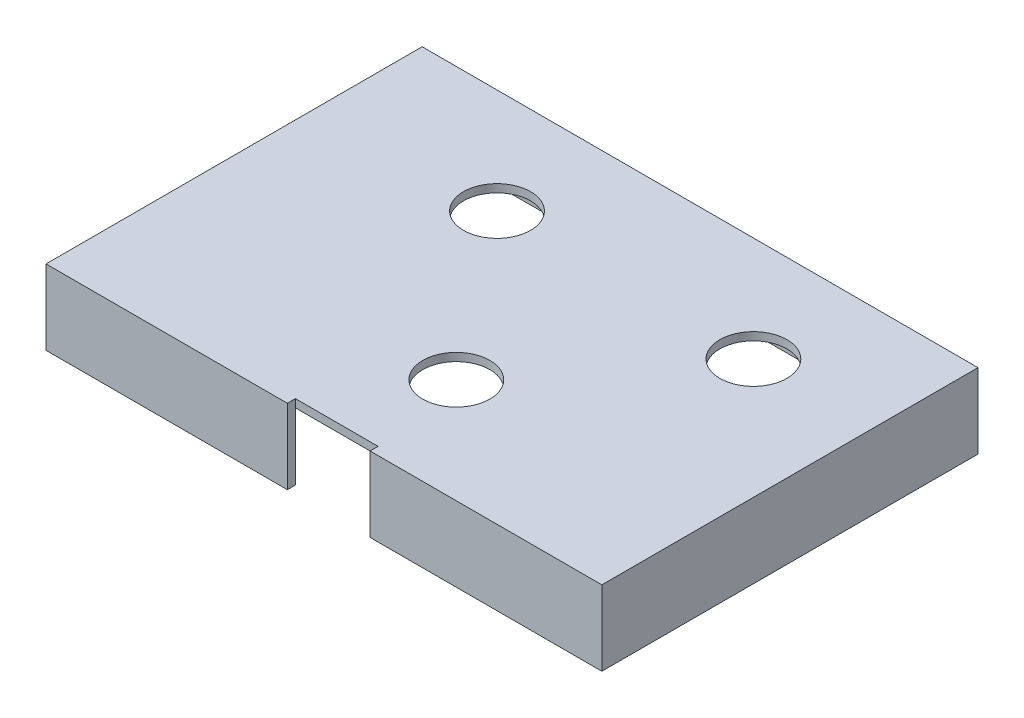
ISO-10303-21;
HEADER;
FILE_DESCRIPTION(('STEP AP214'),'2;1');
FILE_NAME('part.step','',(''),(''),'','','');
FILE_SCHEMA(('AUTOMOTIVE_DESIGN { 1 0 10303 214 1 1 1 1 }'));
ENDSEC;
DATA;
#1=APPLICATION_CONTEXT('core data for automotive mechanical design processes');
#2=APPLICATION_PROTOCOL_DEFINITION('international standard','automotive_design',2000,#1);
#3=PRODUCT_CONTEXT('',#1,'mechanical');
#4=PRODUCT('Part','Part','',(#3));
#5=PRODUCT_RELATED_PRODUCT_CATEGORY('part','',(#4));
#6=PRODUCT_DEFINITION_FORMATION('','',#4);
#7=PRODUCT_DEFINITION_CONTEXT('part definition',#1,'design');
#8=PRODUCT_DEFINITION('design','',#6,#7);
#9=PRODUCT_DEFINITION_SHAPE('','',#8);
#10=(LENGTH_UNIT() NAMED_UNIT(*) SI_UNIT(.MILLI.,.METRE.));
#11=(NAMED_UNIT(*) PLANE_ANGLE_UNIT() SI_UNIT($,.RADIAN.));
#12=(NAMED_UNIT(*) SI_UNIT($,.STERADIAN.) SOLID_ANGLE_UNIT());
#13=UNCERTAINTY_MEASURE_WITH_UNIT(LENGTH_MEASURE(1.E-05),#10,'distance_accuracy_value','');
#14=(GEOMETRIC_REPRESENTATION_CONTEXT(3) GLOBAL_UNCERTAINTY_ASSIGNED_CONTEXT((#13)) GLOBAL_UNIT_ASSIGNED_CONTEXT((#10,
#11,#12)) REPRESENTATION_CONTEXT('',''));
#15=CARTESIAN_POINT('',(0.,0.,0.));
#16=DIRECTION('',(0.,0.,1.));
#17=DIRECTION('',(1.,0.,0.));
#18=AXIS2_PLACEMENT_3D('',#15,#16,#17);
#19=CARTESIAN_POINT('',(0.,31.75,0.));
#20=DIRECTION('',(0.,0.,-1.));
#21=DIRECTION('',(-1.,0.,0.));
#22=AXIS2_PLACEMENT_3D('',#19,#20,#21);
#23=PLANE('',#22);
#24=DIRECTION('',(1.,0.,0.));
#25=VECTOR('',#24,1.);
#26=CARTESIAN_POINT('',(0.,0.,0.));
#27=LINE('',#26,#25);
#28=CARTESIAN_POINT('',(0.,0.,0.));
#29=VERTEX_POINT('',#28);
#30=CARTESIAN_POINT('',(102.362,0.,0.));
#31=VERTEX_POINT('',#30);
#32=EDGE_CURVE('E176',#29,#31,#27,.T.);
#33=ORIENTED_EDGE('',*,*,#32,.T.);
#34=DIRECTION('',(0.,1.,0.));
#35=VECTOR('',#34,1.);
#36=CARTESIAN_POINT('',(102.362,0.,0.));
#37=LINE('',#36,#35);
#38=CARTESIAN_POINT('',(102.362,31.75,0.));
#39=VERTEX_POINT('',#38);
#40=EDGE_CURVE('E229',#31,#39,#37,.T.);
#41=ORIENTED_EDGE('',*,*,#40,.T.);
#42=DIRECTION('',(1.,0.,0.));
#43=VECTOR('',#42,1.);
#44=CARTESIAN_POINT('',(0.,31.75,0.));
#45=LINE('',#44,#43);
#46=CARTESIAN_POINT('',(0.,31.75,0.));
#47=VERTEX_POINT('',#46);
#48=EDGE_CURVE('E284',#47,#39,#45,.T.);
#49=ORIENTED_EDGE('',*,*,#48,.F.);
#50=DIRECTION('',(0.,-1.,0.));
#51=VECTOR('',#50,1.);
#52=CARTESIAN_POINT('',(0.,31.75,0.));
#53=LINE('',#52,#51);
#54=EDGE_CURVE('E11',#47,#29,#53,.T.);
#55=ORIENTED_EDGE('',*,*,#54,.T.);
#56=EDGE_LOOP('',(#33,#41,#49,#55));
#57=FACE_BOUND('',#56,.T.);
#58=ADVANCED_FACE('F45',(#57),#23,.F.);
#59=CARTESIAN_POINT('',(3.40359999999994,28.3464,-3.4036));
#60=DIRECTION('',(0.,0.,1.));
#61=DIRECTION('',(1.,0.,0.));
#62=AXIS2_PLACEMENT_3D('',#59,#60,#61);
#63=PLANE('',#62);
#64=DIRECTION('',(-1.,0.,0.));
#65=VECTOR('',#64,1.);
#66=CARTESIAN_POINT('',(3.40359999999994,28.3464,-3.4036));
#67=LINE('',#66,#65);
#68=CARTESIAN_POINT('',(102.362,28.3464,-3.4036));
#69=VERTEX_POINT('',#68);
#70=CARTESIAN_POINT('',(3.40359999999994,28.3464,-3.4036));
#71=VERTEX_POINT('',#70);
#72=EDGE_CURVE('E251',#69,#71,#67,.T.);
#73=ORIENTED_EDGE('',*,*,#72,.F.);
#74=DIRECTION('',(0.,1.,0.));
#75=VECTOR('',#74,1.);
#76=CARTESIAN_POINT('',(102.362,0.,-3.4036));
#77=LINE('',#76,#75);
#78=CARTESIAN_POINT('',(102.362,0.,-3.4036));
#79=VERTEX_POINT('',#78);
#80=EDGE_CURVE('E63',#79,#69,#77,.T.);
#81=ORIENTED_EDGE('',*,*,#80,.F.);
#82=DIRECTION('',(-1.,0.,0.));
#83=VECTOR('',#82,1.);
#84=CARTESIAN_POINT('',(3.40359999999994,0.,-3.4036));
#85=LINE('',#84,#83);
#86=CARTESIAN_POINT('',(3.40359999999994,0.,-3.4036));
#87=VERTEX_POINT('',#86);
#88=EDGE_CURVE('E268',#79,#87,#85,.T.);
#89=ORIENTED_EDGE('',*,*,#88,.T.);
#90=DIRECTION('',(0.,-1.,0.));
#91=VECTOR('',#90,1.);
#92=CARTESIAN_POINT('',(3.40359999999994,28.3464,-3.4036));
#93=LINE('',#92,#91);
#94=EDGE_CURVE('E183',#71,#87,#93,.T.);
#95=ORIENTED_EDGE('',*,*,#94,.F.);
#96=EDGE_LOOP('',(#73,#81,#89,#95));
#97=FACE_BOUND('',#96,.T.);
#98=ADVANCED_FACE('F315',(#97),#63,.F.);
#99=CARTESIAN_POINT('',(0.,31.75,0.));
#100=DIRECTION('',(1.,0.,0.));
#101=DIRECTION('',(0.,0.,-1.));
#102=AXIS2_PLACEMENT_3D('',#99,#100,#101);
#103=PLANE('',#102);
#104=DIRECTION('',(0.,0.,1.));
#105=VECTOR('',#104,1.);
#106=CARTESIAN_POINT('',(0.,0.,0.));
#107=LINE('',#106,#105);
#108=CARTESIAN_POINT('',(0.,0.,-159.512));
#109=VERTEX_POINT('',#108);
#110=EDGE_CURVE('E177',#109,#29,#107,.T.);
#111=ORIENTED_EDGE('',*,*,#110,.T.);
#112=ORIENTED_EDGE('',*,*,#54,.F.);
#113=DIRECTION('',(0.,0.,1.));
#114=VECTOR('',#113,1.);
#115=CARTESIAN_POINT('',(0.,31.75,0.));
#116=LINE('',#115,#114);
#117=CARTESIAN_POINT('',(0.,31.75,-159.512));
#118=VERTEX_POINT('',#117);
#119=EDGE_CURVE('E192',#118,#47,#116,.T.);
#120=ORIENTED_EDGE('',*,*,#119,.F.);
#121=DIRECTION('',(0.,-1.,0.));
#122=VECTOR('',#121,1.);
#123=CARTESIAN_POINT('',(0.,31.75,-159.512));
#124=LINE('',#123,#122);
#125=EDGE_CURVE('E193',#118,#109,#124,.T.);
#126=ORIENTED_EDGE('',*,*,#125,.T.);
#127=EDGE_LOOP('',(#111,#112,#120,#126));
#128=FACE_BOUND('',#127,.T.);
#129=ADVANCED_FACE('F47',(#128),#103,.F.);
#130=CARTESIAN_POINT('',(137.414,31.75,0.));
#131=VERTEX_POINT('',#130);
#132=CARTESIAN_POINT('',(235.712,31.75,0.));
#133=VERTEX_POINT('',#132);
#134=EDGE_CURVE('E166',#131,#133,#45,.T.);
#135=ORIENTED_EDGE('',*,*,#134,.F.);
#136=DIRECTION('',(0.,1.,0.));
#137=VECTOR('',#136,1.);
#138=CARTESIAN_POINT('',(137.414,0.,0.));
#139=LINE('',#138,#137);
#140=CARTESIAN_POINT('',(137.414,0.,0.));
#141=VERTEX_POINT('',#140);
#142=EDGE_CURVE('E147',#141,#131,#139,.T.);
#143=ORIENTED_EDGE('',*,*,#142,.F.);
#144=CARTESIAN_POINT('',(235.712,0.,0.));
#145=VERTEX_POINT('',#144);
#146=EDGE_CURVE('E164',#141,#145,#27,.T.);
#147=ORIENTED_EDGE('',*,*,#146,.T.);
#148=DIRECTION('',(0.,-1.,0.));
#149=VECTOR('',#148,1.);
#150=CARTESIAN_POINT('',(235.712,31.75,0.));
#151=LINE('',#150,#149);
#152=EDGE_CURVE('E55',#133,#145,#151,.T.);
#153=ORIENTED_EDGE('',*,*,#152,.F.);
#154=EDGE_LOOP('',(#135,#143,#147,#153));
#155=FACE_BOUND('',#154,.T.);
#156=ADVANCED_FACE('F162',(#155),#23,.F.);
#157=CARTESIAN_POINT('',(235.712,31.75,0.));
#158=DIRECTION('',(-1.,0.,0.));
#159=DIRECTION('',(0.,0.,1.));
#160=AXIS2_PLACEMENT_3D('',#157,#158,#159);
#161=PLANE('',#160);
#162=DIRECTION('',(0.,0.,-1.));
#163=VECTOR('',#162,1.);
#164=CARTESIAN_POINT('',(235.712,0.,0.));
#165=LINE('',#164,#163);
#166=CARTESIAN_POINT('',(235.712,0.,-159.512));
#167=VERTEX_POINT('',#166);
#168=EDGE_CURVE('E174',#145,#167,#165,.T.);
#169=ORIENTED_EDGE('',*,*,#168,.T.);
#170=DIRECTION('',(0.,-1.,0.));
#171=VECTOR('',#170,1.);
#172=CARTESIAN_POINT('',(235.712,31.75,-159.512));
#173=LINE('',#172,#171);
#174=CARTESIAN_POINT('',(235.712,31.75,-159.512));
#175=VERTEX_POINT('',#174);
#176=EDGE_CURVE('E197',#175,#167,#173,.T.);
#177=ORIENTED_EDGE('',*,*,#176,.F.);
#178=DIRECTION('',(0.,0.,-1.));
#179=VECTOR('',#178,1.);
#180=CARTESIAN_POINT('',(235.712,31.75,0.));
#181=LINE('',#180,#179);
#182=EDGE_CURVE('E288',#133,#175,#181,.T.);
#183=ORIENTED_EDGE('',*,*,#182,.F.);
#184=ORIENTED_EDGE('',*,*,#152,.T.);
#185=EDGE_LOOP('',(#169,#177,#183,#184));
#186=FACE_BOUND('',#185,.T.);
#187=ADVANCED_FACE('F354',(#186),#161,.F.);
#188=CARTESIAN_POINT('',(0.,31.75,-159.512));
#189=DIRECTION('',(0.,0.,1.));
#190=DIRECTION('',(1.,0.,0.));
#191=AXIS2_PLACEMENT_3D('',#188,#189,#190);
#192=PLANE('',#191);
#193=DIRECTION('',(-1.,0.,0.));
#194=VECTOR('',#193,1.);
#195=CARTESIAN_POINT('',(0.,0.,-159.512));
#196=LINE('',#195,#194);
#197=EDGE_CURVE('E189',#167,#109,#196,.T.);
#198=ORIENTED_EDGE('',*,*,#197,.T.);
#199=ORIENTED_EDGE('',*,*,#125,.F.);
#200=DIRECTION('',(-1.,0.,0.));
#201=VECTOR('',#200,1.);
#202=CARTESIAN_POINT('',(0.,31.75,-159.512));
#203=LINE('',#202,#201);
#204=EDGE_CURVE('E198',#175,#118,#203,.T.);
#205=ORIENTED_EDGE('',*,*,#204,.F.);
#206=ORIENTED_EDGE('',*,*,#176,.T.);
#207=EDGE_LOOP('',(#198,#199,#205,#206));
#208=FACE_BOUND('',#207,.T.);
#209=ADVANCED_FACE('F300',(#208),#192,.F.);
#210=CARTESIAN_POINT('',(0.,31.75,0.));
#211=DIRECTION('',(0.,-1.,0.));
#212=DIRECTION('',(0.,0.,-1.));
#213=AXIS2_PLACEMENT_3D('',#210,#211,#212);
#214=PLANE('',#213);
#215=CARTESIAN_POINT('',(76.1999999999999,31.75,-115.062));
#216=DIRECTION('',(0.,1.,0.));
#217=DIRECTION('',(0.,0.,1.));
#218=AXIS2_PLACEMENT_3D('',#215,#216,#217);
#219=CIRCLE('',#218,14.224);
#220=CARTESIAN_POINT('',(76.1999999999999,31.75,-100.838));
#221=VERTEX_POINT('',#220);
#222=EDGE_CURVE('E208',#221,#221,#219,.T.);
#223=ORIENTED_EDGE('',*,*,#222,.F.);
#224=EDGE_LOOP('',(#223));
#225=FACE_BOUND('',#224,.T.);
#226=CARTESIAN_POINT('',(129.54,31.75,-44.45));
#227=DIRECTION('',(0.,1.,0.));
#228=DIRECTION('',(0.,0.,1.));
#229=AXIS2_PLACEMENT_3D('',#226,#227,#228);
#230=CIRCLE('',#229,14.224);
#231=CARTESIAN_POINT('',(129.54,31.75,-30.226));
#232=VERTEX_POINT('',#231);
#233=EDGE_CURVE('E488',#232,#232,#230,.T.);
#234=ORIENTED_EDGE('',*,*,#233,.F.);
#235=EDGE_LOOP('',(#234));
#236=FACE_BOUND('',#235,.T.);
#237=CARTESIAN_POINT('',(184.912,31.75,-115.062));
#238=DIRECTION('',(0.,1.,0.));
#239=DIRECTION('',(0.,0.,1.));
#240=AXIS2_PLACEMENT_3D('',#237,#238,#239);
#241=CIRCLE('',#240,14.224);
#242=CARTESIAN_POINT('',(184.912,31.75,-100.838));
#243=VERTEX_POINT('',#242);
#244=EDGE_CURVE('E492',#243,#243,#241,.T.);
#245=ORIENTED_EDGE('',*,*,#244,.F.);
#246=EDGE_LOOP('',(#245));
#247=FACE_BOUND('',#246,.T.);
#248=ORIENTED_EDGE('',*,*,#48,.T.);
#249=DIRECTION('',(0.,0.,1.));
#250=VECTOR('',#249,1.);
#251=CARTESIAN_POINT('',(102.362,31.75,0.));
#252=LINE('',#251,#250);
#253=CARTESIAN_POINT('',(102.362,31.75,-3.4036));
#254=VERTEX_POINT('',#253);
#255=EDGE_CURVE('E158',#254,#39,#252,.T.);
#256=ORIENTED_EDGE('',*,*,#255,.F.);
#257=DIRECTION('',(-1.,0.,0.));
#258=VECTOR('',#257,1.);
#259=CARTESIAN_POINT('',(102.362,31.75,-3.4036));
#260=LINE('',#259,#258);
#261=CARTESIAN_POINT('',(137.414,31.75,-3.4036));
#262=VERTEX_POINT('',#261);
#263=EDGE_CURVE('E219',#262,#254,#260,.T.);
#264=ORIENTED_EDGE('',*,*,#263,.F.);
#265=DIRECTION('',(0.,0.,-1.));
#266=VECTOR('',#265,1.);
#267=CARTESIAN_POINT('',(137.414,31.75,-3.4036));
#268=LINE('',#267,#266);
#269=EDGE_CURVE('E215',#131,#262,#268,.T.);
#270=ORIENTED_EDGE('',*,*,#269,.F.);
#271=ORIENTED_EDGE('',*,*,#134,.T.);
#272=ORIENTED_EDGE('',*,*,#182,.T.);
#273=ORIENTED_EDGE('',*,*,#204,.T.);
#274=ORIENTED_EDGE('',*,*,#119,.T.);
#275=EDGE_LOOP('',(#248,#256,#264,#270,#271,#272,#273,#274));
#276=FACE_BOUND('',#275,.T.);
#277=ADVANCED_FACE('F294',(#225,#236,#247,#276),#214,.F.);
#278=CARTESIAN_POINT('',(0.,0.,0.));
#279=DIRECTION('',(0.,-1.,0.));
#280=DIRECTION('',(0.,0.,-1.));
#281=AXIS2_PLACEMENT_3D('',#278,#279,#280);
#282=PLANE('',#281);
#283=DIRECTION('',(0.,0.,1.));
#284=VECTOR('',#283,1.);
#285=CARTESIAN_POINT('',(102.362,0.,0.));
#286=LINE('',#285,#284);
#287=EDGE_CURVE('E157',#79,#31,#286,.T.);
#288=ORIENTED_EDGE('',*,*,#287,.T.);
#289=ORIENTED_EDGE('',*,*,#32,.F.);
#290=ORIENTED_EDGE('',*,*,#110,.F.);
#291=ORIENTED_EDGE('',*,*,#197,.F.);
#292=ORIENTED_EDGE('',*,*,#168,.F.);
#293=ORIENTED_EDGE('',*,*,#146,.F.);
#294=DIRECTION('',(0.,0.,-1.));
#295=VECTOR('',#294,1.);
#296=CARTESIAN_POINT('',(137.414,0.,-3.4036));
#297=LINE('',#296,#295);
#298=CARTESIAN_POINT('',(137.414,0.,-3.4036));
#299=VERTEX_POINT('',#298);
#300=EDGE_CURVE('E143',#141,#299,#297,.T.);
#301=ORIENTED_EDGE('',*,*,#300,.T.);
#302=CARTESIAN_POINT('',(232.3084,0.,-3.4036));
#303=VERTEX_POINT('',#302);
#304=EDGE_CURVE('E243',#303,#299,#85,.T.);
#305=ORIENTED_EDGE('',*,*,#304,.F.);
#306=DIRECTION('',(0.,0.,1.));
#307=VECTOR('',#306,1.);
#308=CARTESIAN_POINT('',(232.3084,0.,-3.4036));
#309=LINE('',#308,#307);
#310=CARTESIAN_POINT('',(232.3084,0.,-156.1084));
#311=VERTEX_POINT('',#310);
#312=EDGE_CURVE('E264',#311,#303,#309,.T.);
#313=ORIENTED_EDGE('',*,*,#312,.F.);
#314=DIRECTION('',(1.,0.,0.));
#315=VECTOR('',#314,1.);
#316=CARTESIAN_POINT('',(3.40359999999996,0.,-156.1084));
#317=LINE('',#316,#315);
#318=CARTESIAN_POINT('',(3.40359999999996,0.,-156.1084));
#319=VERTEX_POINT('',#318);
#320=EDGE_CURVE('E260',#319,#311,#317,.T.);
#321=ORIENTED_EDGE('',*,*,#320,.F.);
#322=DIRECTION('',(0.,0.,-1.));
#323=VECTOR('',#322,1.);
#324=CARTESIAN_POINT('',(3.40359999999994,0.,-3.4036));
#325=LINE('',#324,#323);
#326=EDGE_CURVE('E71',#87,#319,#325,.T.);
#327=ORIENTED_EDGE('',*,*,#326,.F.);
#328=ORIENTED_EDGE('',*,*,#88,.F.);
#329=EDGE_LOOP('',(#288,#289,#290,#291,#292,#293,#301,#305,#313,#321,#327,#328));
#330=FACE_BOUND('',#329,.T.);
#331=ADVANCED_FACE('F172',(#330),#282,.T.);
#332=CARTESIAN_POINT('',(3.40359999999994,28.3464,-3.4036));
#333=DIRECTION('',(-1.,0.,0.));
#334=DIRECTION('',(0.,0.,1.));
#335=AXIS2_PLACEMENT_3D('',#332,#333,#334);
#336=PLANE('',#335);
#337=ORIENTED_EDGE('',*,*,#326,.T.);
#338=DIRECTION('',(0.,-1.,0.));
#339=VECTOR('',#338,1.);
#340=CARTESIAN_POINT('',(3.40359999999996,28.3464,-156.1084));
#341=LINE('',#340,#339);
#342=CARTESIAN_POINT('',(3.40359999999996,28.3464,-156.1084));
#343=VERTEX_POINT('',#342);
#344=EDGE_CURVE('E256',#343,#319,#341,.T.);
#345=ORIENTED_EDGE('',*,*,#344,.F.);
#346=DIRECTION('',(0.,0.,-1.));
#347=VECTOR('',#346,1.);
#348=CARTESIAN_POINT('',(3.40359999999994,28.3464,-3.4036));
#349=LINE('',#348,#347);
#350=EDGE_CURVE('E238',#71,#343,#349,.T.);
#351=ORIENTED_EDGE('',*,*,#350,.F.);
#352=ORIENTED_EDGE('',*,*,#94,.T.);
#353=EDGE_LOOP('',(#337,#345,#351,#352));
#354=FACE_BOUND('',#353,.T.);
#355=ADVANCED_FACE('F334',(#354),#336,.F.);
#356=ORIENTED_EDGE('',*,*,#304,.T.);
#357=DIRECTION('',(0.,1.,0.));
#358=VECTOR('',#357,1.);
#359=CARTESIAN_POINT('',(137.414,0.,-3.4036));
#360=LINE('',#359,#358);
#361=CARTESIAN_POINT('',(137.414,28.3464,-3.4036));
#362=VERTEX_POINT('',#361);
#363=EDGE_CURVE('E151',#299,#362,#360,.T.);
#364=ORIENTED_EDGE('',*,*,#363,.T.);
#365=CARTESIAN_POINT('',(232.3084,28.3464,-3.4036));
#366=VERTEX_POINT('',#365);
#367=EDGE_CURVE('E252',#366,#362,#67,.T.);
#368=ORIENTED_EDGE('',*,*,#367,.F.);
#369=DIRECTION('',(0.,-1.,0.));
#370=VECTOR('',#369,1.);
#371=CARTESIAN_POINT('',(232.3084,28.3464,-3.4036));
#372=LINE('',#371,#370);
#373=EDGE_CURVE('E273',#366,#303,#372,.T.);
#374=ORIENTED_EDGE('',*,*,#373,.T.);
#375=EDGE_LOOP('',(#356,#364,#368,#374));
#376=FACE_BOUND('',#375,.T.);
#377=ADVANCED_FACE('F326',(#376),#63,.F.);
#378=CARTESIAN_POINT('',(232.3084,28.3464,-3.4036));
#379=DIRECTION('',(1.,0.,0.));
#380=DIRECTION('',(0.,0.,-1.));
#381=AXIS2_PLACEMENT_3D('',#378,#379,#380);
#382=PLANE('',#381);
#383=ORIENTED_EDGE('',*,*,#312,.T.);
#384=ORIENTED_EDGE('',*,*,#373,.F.);
#385=DIRECTION('',(0.,0.,1.));
#386=VECTOR('',#385,1.);
#387=CARTESIAN_POINT('',(232.3084,28.3464,-3.4036));
#388=LINE('',#387,#386);
#389=CARTESIAN_POINT('',(232.3084,28.3464,-156.1084));
#390=VERTEX_POINT('',#389);
#391=EDGE_CURVE('E247',#390,#366,#388,.T.);
#392=ORIENTED_EDGE('',*,*,#391,.F.);
#393=DIRECTION('',(0.,-1.,0.));
#394=VECTOR('',#393,1.);
#395=CARTESIAN_POINT('',(232.3084,28.3464,-156.1084));
#396=LINE('',#395,#394);
#397=EDGE_CURVE('E276',#390,#311,#396,.T.);
#398=ORIENTED_EDGE('',*,*,#397,.T.);
#399=EDGE_LOOP('',(#383,#384,#392,#398));
#400=FACE_BOUND('',#399,.T.);
#401=ADVANCED_FACE('F330',(#400),#382,.F.);
#402=CARTESIAN_POINT('',(3.40359999999996,28.3464,-156.1084));
#403=DIRECTION('',(0.,0.,-1.));
#404=DIRECTION('',(-1.,0.,0.));
#405=AXIS2_PLACEMENT_3D('',#402,#403,#404);
#406=PLANE('',#405);
#407=ORIENTED_EDGE('',*,*,#320,.T.);
#408=ORIENTED_EDGE('',*,*,#397,.F.);
#409=DIRECTION('',(1.,0.,0.));
#410=VECTOR('',#409,1.);
#411=CARTESIAN_POINT('',(3.40359999999996,28.3464,-156.1084));
#412=LINE('',#411,#410);
#413=EDGE_CURVE('E242',#343,#390,#412,.T.);
#414=ORIENTED_EDGE('',*,*,#413,.F.);
#415=ORIENTED_EDGE('',*,*,#344,.T.);
#416=EDGE_LOOP('',(#407,#408,#414,#415));
#417=FACE_BOUND('',#416,.T.);
#418=ADVANCED_FACE('F333',(#417),#406,.F.);
#419=CARTESIAN_POINT('',(0.,28.3464,0.));
#420=DIRECTION('',(0.,-1.,0.));
#421=DIRECTION('',(0.,0.,-1.));
#422=AXIS2_PLACEMENT_3D('',#419,#420,#421);
#423=PLANE('',#422);
#424=CARTESIAN_POINT('',(76.1999999999999,28.3464,-115.062));
#425=DIRECTION('',(0.,-1.,0.));
#426=DIRECTION('',(0.,0.,-1.));
#427=AXIS2_PLACEMENT_3D('',#424,#425,#426);
#428=CIRCLE('',#427,14.224);
#429=CARTESIAN_POINT('',(76.1999999999999,28.3464,-129.286));
#430=VERTEX_POINT('',#429);
#431=EDGE_CURVE('E49',#430,#430,#428,.T.);
#432=ORIENTED_EDGE('',*,*,#431,.F.);
#433=EDGE_LOOP('',(#432));
#434=FACE_BOUND('',#433,.T.);
#435=CARTESIAN_POINT('',(129.54,28.3464,-44.45));
#436=DIRECTION('',(0.,-1.,0.));
#437=DIRECTION('',(0.,0.,-1.));
#438=AXIS2_PLACEMENT_3D('',#435,#436,#437);
#439=CIRCLE('',#438,14.224);
#440=CARTESIAN_POINT('',(129.54,28.3464,-58.674));
#441=VERTEX_POINT('',#440);
#442=EDGE_CURVE('E207',#441,#441,#439,.T.);
#443=ORIENTED_EDGE('',*,*,#442,.F.);
#444=EDGE_LOOP('',(#443));
#445=FACE_BOUND('',#444,.T.);
#446=CARTESIAN_POINT('',(184.912,28.3464,-115.062));
#447=DIRECTION('',(0.,-1.,0.));
#448=DIRECTION('',(0.,0.,-1.));
#449=AXIS2_PLACEMENT_3D('',#446,#447,#448);
#450=CIRCLE('',#449,14.224);
#451=CARTESIAN_POINT('',(184.912,28.3464,-129.286));
#452=VERTEX_POINT('',#451);
#453=EDGE_CURVE('E204',#452,#452,#450,.T.);
#454=ORIENTED_EDGE('',*,*,#453,.F.);
#455=EDGE_LOOP('',(#454));
#456=FACE_BOUND('',#455,.T.);
#457=ORIENTED_EDGE('',*,*,#350,.T.);
#458=ORIENTED_EDGE('',*,*,#413,.T.);
#459=ORIENTED_EDGE('',*,*,#391,.T.);
#460=ORIENTED_EDGE('',*,*,#367,.T.);
#461=EDGE_CURVE('E257',#362,#69,#67,.T.);
#462=ORIENTED_EDGE('',*,*,#461,.T.);
#463=ORIENTED_EDGE('',*,*,#72,.T.);
#464=EDGE_LOOP('',(#457,#458,#459,#460,#462,#463));
#465=FACE_BOUND('',#464,.T.);
#466=ADVANCED_FACE('F320',(#434,#445,#456,#465),#423,.T.);
#467=CARTESIAN_POINT('',(102.362,0.,0.));
#468=DIRECTION('',(-1.,0.,0.));
#469=DIRECTION('',(0.,0.,1.));
#470=AXIS2_PLACEMENT_3D('',#467,#468,#469);
#471=PLANE('',#470);
#472=ORIENTED_EDGE('',*,*,#255,.T.);
#473=ORIENTED_EDGE('',*,*,#40,.F.);
#474=ORIENTED_EDGE('',*,*,#287,.F.);
#475=ORIENTED_EDGE('',*,*,#80,.T.);
#476=EDGE_CURVE('E235',#69,#254,#77,.T.);
#477=ORIENTED_EDGE('',*,*,#476,.T.);
#478=EDGE_LOOP('',(#472,#473,#474,#475,#477));
#479=FACE_BOUND('',#478,.T.);
#480=ADVANCED_FACE('F305',(#479),#471,.F.);
#481=CARTESIAN_POINT('',(102.362,0.,-3.4036));
#482=DIRECTION('',(0.,0.,-1.));
#483=DIRECTION('',(-1.,0.,0.));
#484=AXIS2_PLACEMENT_3D('',#481,#482,#483);
#485=PLANE('',#484);
#486=ORIENTED_EDGE('',*,*,#461,.F.);
#487=EDGE_CURVE('E168',#362,#262,#360,.T.);
#488=ORIENTED_EDGE('',*,*,#487,.T.);
#489=ORIENTED_EDGE('',*,*,#263,.T.);
#490=ORIENTED_EDGE('',*,*,#476,.F.);
#491=EDGE_LOOP('',(#486,#488,#489,#490));
#492=FACE_BOUND('',#491,.T.);
#493=ADVANCED_FACE('F309',(#492),#485,.F.);
#494=CARTESIAN_POINT('',(137.414,0.,-3.4036));
#495=DIRECTION('',(1.,0.,0.));
#496=DIRECTION('',(0.,0.,-1.));
#497=AXIS2_PLACEMENT_3D('',#494,#495,#496);
#498=PLANE('',#497);
#499=ORIENTED_EDGE('',*,*,#269,.T.);
#500=ORIENTED_EDGE('',*,*,#487,.F.);
#501=ORIENTED_EDGE('',*,*,#363,.F.);
#502=ORIENTED_EDGE('',*,*,#300,.F.);
#503=ORIENTED_EDGE('',*,*,#142,.T.);
#504=EDGE_LOOP('',(#499,#500,#501,#502,#503));
#505=FACE_BOUND('',#504,.T.);
#506=ADVANCED_FACE('F146',(#505),#498,.F.);
#507=CARTESIAN_POINT('',(184.912,0.,-115.062));
#508=DIRECTION('',(0.,1.,0.));
#509=DIRECTION('',(0.,0.,1.));
#510=AXIS2_PLACEMENT_3D('',#507,#508,#509);
#511=CYLINDRICAL_SURFACE('',#510,14.224);
#512=ORIENTED_EDGE('',*,*,#453,.T.);
#513=EDGE_LOOP('',(#512));
#514=FACE_BOUND('',#513,.T.);
#515=ORIENTED_EDGE('',*,*,#244,.T.);
#516=EDGE_LOOP('',(#515));
#517=FACE_BOUND('',#516,.T.);
#518=ADVANCED_FACE('F455',(#514,#517),#511,.F.);
#519=CARTESIAN_POINT('',(129.54,0.,-44.45));
#520=DIRECTION('',(0.,1.,0.));
#521=DIRECTION('',(0.,0.,1.));
#522=AXIS2_PLACEMENT_3D('',#519,#520,#521);
#523=CYLINDRICAL_SURFACE('',#522,14.224);
#524=ORIENTED_EDGE('',*,*,#442,.T.);
#525=EDGE_LOOP('',(#524));
#526=FACE_BOUND('',#525,.T.);
#527=ORIENTED_EDGE('',*,*,#233,.T.);
#528=EDGE_LOOP('',(#527));
#529=FACE_BOUND('',#528,.T.);
#530=ADVANCED_FACE('F463',(#526,#529),#523,.F.);
#531=CARTESIAN_POINT('',(76.1999999999999,0.,-115.062));
#532=DIRECTION('',(0.,1.,0.));
#533=DIRECTION('',(0.,0.,1.));
#534=AXIS2_PLACEMENT_3D('',#531,#532,#533);
#535=CYLINDRICAL_SURFACE('',#534,14.224);
#536=ORIENTED_EDGE('',*,*,#431,.T.);
#537=EDGE_LOOP('',(#536));
#538=FACE_BOUND('',#537,.T.);
#539=ORIENTED_EDGE('',*,*,#222,.T.);
#540=EDGE_LOOP('',(#539));
#541=FACE_BOUND('',#540,.T.);
#542=ADVANCED_FACE('F473',(#538,#541),#535,.F.);
#543=CLOSED_SHELL('',(#58,#98,#129,#156,#187,#209,#277,#331,#355,#377,#401,#418,#466,#480,#493,
#506,#518,#530,#542));
#544=MANIFOLD_SOLID_BREP('B2',#543);
#545=ADVANCED_BREP_SHAPE_REPRESENTATION('',(#18,#544),#14);
#546=SHAPE_DEFINITION_REPRESENTATION(#9,#545);
ENDSEC;
END-ISO-10303-21;
